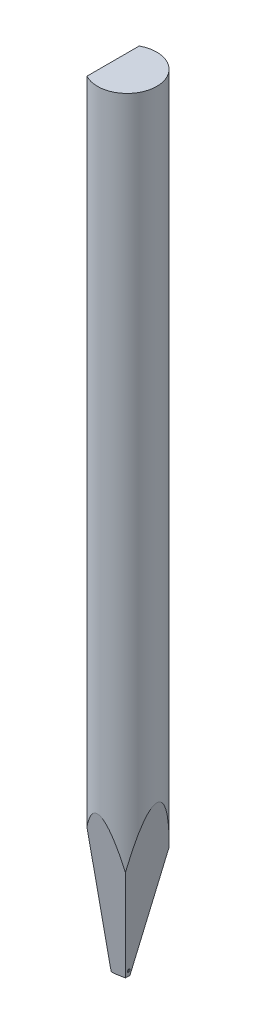
ISO-10303-21;
HEADER;
FILE_DESCRIPTION(('STEP AP214'),'2;1');
FILE_NAME('part.step','',(''),(''),'','','');
FILE_SCHEMA(('AUTOMOTIVE_DESIGN { 1 0 10303 214 1 1 1 1 }'));
ENDSEC;
DATA;
#1=APPLICATION_CONTEXT('core data for automotive mechanical design processes');
#2=APPLICATION_PROTOCOL_DEFINITION('international standard','automotive_design',2000,#1);
#3=PRODUCT_CONTEXT('',#1,'mechanical');
#4=PRODUCT('Part','Part','',(#3));
#5=PRODUCT_RELATED_PRODUCT_CATEGORY('part','',(#4));
#6=PRODUCT_DEFINITION_FORMATION('','',#4);
#7=PRODUCT_DEFINITION_CONTEXT('part definition',#1,'design');
#8=PRODUCT_DEFINITION('design','',#6,#7);
#9=PRODUCT_DEFINITION_SHAPE('','',#8);
#10=(LENGTH_UNIT() NAMED_UNIT(*) SI_UNIT(.MILLI.,.METRE.));
#11=(NAMED_UNIT(*) PLANE_ANGLE_UNIT() SI_UNIT($,.RADIAN.));
#12=(NAMED_UNIT(*) SI_UNIT($,.STERADIAN.) SOLID_ANGLE_UNIT());
#13=UNCERTAINTY_MEASURE_WITH_UNIT(LENGTH_MEASURE(1.E-05),#10,'distance_accuracy_value','');
#14=(GEOMETRIC_REPRESENTATION_CONTEXT(3) GLOBAL_UNCERTAINTY_ASSIGNED_CONTEXT((#13)) GLOBAL_UNIT_ASSIGNED_CONTEXT((#10,
#11,#12)) REPRESENTATION_CONTEXT('',''));
#15=CARTESIAN_POINT('',(0.,0.,0.));
#16=DIRECTION('',(0.,0.,1.));
#17=DIRECTION('',(1.,0.,0.));
#18=AXIS2_PLACEMENT_3D('',#15,#16,#17);
#19=CARTESIAN_POINT('',(26.8738719491216,0.,0.0508));
#20=DIRECTION('',(0.,-0.173648177666931,0.984807753012208));
#21=DIRECTION('',(0.,-0.984807753012208,-0.173648177666931));
#22=AXIS2_PLACEMENT_3D('',#19,#20,#21);
#23=PLANE('',#22);
#24=CARTESIAN_POINT('',(-0.35306,0.02286,0.0548308347789947));
#25=DIRECTION('',(0.,-0.173648177666931,0.984807753012208));
#26=DIRECTION('',(0.,-0.984807753012208,-0.173648177666931));
#27=AXIS2_PLACEMENT_3D('',#24,#25,#26);
#28=ELLIPSE('',#27,0.0232126523477081,0.02286);
#29=CARTESIAN_POINT('',(-0.353059999999999,0.,0.0507920612593779));
#30=VERTEX_POINT('',#29);
#31=CARTESIAN_POINT('',(-0.37592,0.02286,0.0548308347789947));
#32=VERTEX_POINT('',#31);
#33=EDGE_CURVE('E68',#30,#32,#28,.F.);
#34=ORIENTED_EDGE('',*,*,#33,.F.);
#35=CARTESIAN_POINT('',(-0.287020000000002,0.,0.0507841225187557));
#36=DIRECTION('',(-1.,0.,0.));
#37=VECTOR('',#36,1.);
#38=LINE('',#35,#37);
#39=CARTESIAN_POINT('',(-0.287019999999999,0.,0.0507920612593779));
#40=VERTEX_POINT('',#39);
#41=EDGE_CURVE('E234',#40,#30,#38,.T.);
#42=ORIENTED_EDGE('',*,*,#41,.F.);
#43=DIRECTION('',(-0.984346441568213,-0.173566836012845,-0.0306045161452665));
#44=VECTOR('',#43,1.);
#45=CARTESIAN_POINT('',(26.0301980698046,4.64043560289492,0.869033999030531));
#46=LINE('',#45,#44);
#47=CARTESIAN_POINT('',(0.0144531636701099,0.0531578527145794,0.060173163670107));
#48=VERTEX_POINT('',#47);
#49=EDGE_CURVE('E242',#48,#40,#46,.T.);
#50=ORIENTED_EDGE('',*,*,#49,.F.);
#51=DIRECTION('',(-0.171087869746036,-0.970287525247814,-0.171087869746036));
#52=VECTOR('',#51,1.);
#53=CARTESIAN_POINT('',(0.791557999082992,4.46033837772866,0.837277999082991));
#54=LINE('',#53,#52);
#55=CARTESIAN_POINT('',(0.537041505266774,3.0169036135559,0.582761505266773));
#56=VERTEX_POINT('',#55);
#57=EDGE_CURVE('E411',#56,#48,#54,.T.);
#58=ORIENTED_EDGE('',*,*,#57,.F.);
#59=CARTESIAN_POINT('',(0.,-0.288101116436578,0.));
#60=DIRECTION('',(0.,-0.173648177666931,0.984807753012208));
#61=DIRECTION('',(0.,-0.984807753012208,-0.173648177666931));
#62=AXIS2_PLACEMENT_3D('',#59,#60,#61);
#63=ELLIPSE('',#62,4.56371043248163,0.792479999999998);
#64=CARTESIAN_POINT('',(-0.37592,3.66844093071415,0.69764511322018));
#65=VERTEX_POINT('',#64);
#66=EDGE_CURVE('E447',#56,#65,#63,.T.);
#67=ORIENTED_EDGE('',*,*,#66,.T.);
#68=DIRECTION('',(0.,0.984807753012208,0.173648177666931));
#69=VECTOR('',#68,1.);
#70=CARTESIAN_POINT('',(-0.37592,20.251112252608,3.62161747949059));
#71=LINE('',#70,#69);
#72=EDGE_CURVE('E54',#32,#65,#71,.T.);
#73=ORIENTED_EDGE('',*,*,#72,.F.);
#74=EDGE_LOOP('',(#34,#42,#50,#58,#67,#73));
#75=FACE_BOUND('',#74,.T.);
#76=ADVANCED_FACE('F46',(#75),#23,.T.);
#77=CARTESIAN_POINT('',(26.8738719491216,0.,-0.0508));
#78=DIRECTION('',(0.,-0.173648177666931,-0.984807753012208));
#79=DIRECTION('',(0.,0.984807753012208,-0.173648177666931));
#80=AXIS2_PLACEMENT_3D('',#77,#78,#79);
#81=PLANE('',#80);
#82=CARTESIAN_POINT('',(-0.35306,0.02286,-0.0548308347789947));
#83=DIRECTION('',(0.,-0.173648177666931,-0.984807753012208));
#84=DIRECTION('',(0.,0.984807753012208,-0.173648177666931));
#85=AXIS2_PLACEMENT_3D('',#82,#83,#84);
#86=ELLIPSE('',#85,0.0232126523477081,0.02286);
#87=CARTESIAN_POINT('',(-0.37592,0.02286,-0.0548308347789947));
#88=VERTEX_POINT('',#87);
#89=CARTESIAN_POINT('',(-0.353059999999999,0.,-0.0507920612593779));
#90=VERTEX_POINT('',#89);
#91=EDGE_CURVE('E181',#88,#90,#86,.F.);
#92=ORIENTED_EDGE('',*,*,#91,.F.);
#93=DIRECTION('',(0.,-0.984807753012208,0.173648177666931));
#94=VECTOR('',#93,1.);
#95=CARTESIAN_POINT('',(-0.37592,20.5255765703836,-3.67001294395617));
#96=LINE('',#95,#94);
#97=CARTESIAN_POINT('',(-0.37592,3.66844093071414,-0.69764511322018));
#98=VERTEX_POINT('',#97);
#99=EDGE_CURVE('E174',#98,#88,#96,.T.);
#100=ORIENTED_EDGE('',*,*,#99,.F.);
#101=CARTESIAN_POINT('',(0.,-0.288101116436578,0.));
#102=DIRECTION('',(0.,-0.173648177666931,-0.984807753012208));
#103=DIRECTION('',(0.,-0.984807753012208,0.173648177666931));
#104=AXIS2_PLACEMENT_3D('',#101,#102,#103);
#105=ELLIPSE('',#104,4.56371043248163,0.792479999999998);
#106=CARTESIAN_POINT('',(0.537041505266774,3.0169036135559,-0.582761505266773));
#107=VERTEX_POINT('',#106);
#108=EDGE_CURVE('E448',#98,#107,#105,.T.);
#109=ORIENTED_EDGE('',*,*,#108,.T.);
#110=DIRECTION('',(0.171087869746036,0.970287525247814,-0.171087869746036));
#111=VECTOR('',#110,1.);
#112=CARTESIAN_POINT('',(0.791557999082992,4.46033837772866,-0.837277999082991));
#113=LINE('',#112,#111);
#114=CARTESIAN_POINT('',(0.0144531636701099,0.0531578527145794,-0.060173163670107));
#115=VERTEX_POINT('',#114);
#116=EDGE_CURVE('E422',#115,#107,#113,.T.);
#117=ORIENTED_EDGE('',*,*,#116,.F.);
#118=DIRECTION('',(0.984346441568213,0.173566836012845,-0.0306045161452665));
#119=VECTOR('',#118,1.);
#120=CARTESIAN_POINT('',(26.0301980698046,4.64043560289492,-0.869033999030531));
#121=LINE('',#120,#119);
#122=CARTESIAN_POINT('',(-0.287019999999999,0.,-0.0507920612593778));
#123=VERTEX_POINT('',#122);
#124=EDGE_CURVE('E419',#123,#115,#121,.T.);
#125=ORIENTED_EDGE('',*,*,#124,.F.);
#126=CARTESIAN_POINT('',(-0.287019999999996,0.,-0.0508000000000001));
#127=DIRECTION('',(-1.,0.,0.));
#128=VECTOR('',#127,1.);
#129=LINE('',#126,#128);
#130=EDGE_CURVE('E241',#123,#90,#129,.T.);
#131=ORIENTED_EDGE('',*,*,#130,.T.);
#132=EDGE_LOOP('',(#92,#100,#109,#117,#125,#131));
#133=FACE_BOUND('',#132,.T.);
#134=ADVANCED_FACE('F388',(#133),#81,.T.);
#135=CARTESIAN_POINT('',(-0.28702,0.,27.2760283406468));
#136=DIRECTION('',(-0.173648177666931,0.984807753012208,0.));
#137=DIRECTION('',(-0.984807753012208,-0.173648177666931,0.));
#138=AXIS2_PLACEMENT_3D('',#135,#136,#137);
#139=PLANE('',#138);
#140=DIRECTION('',(-0.984807753012208,-0.173648177666931,0.));
#141=VECTOR('',#140,1.);
#142=CARTESIAN_POINT('',(-0.28702,0.,0.0285749999999994));
#143=LINE('',#142,#141);
#144=CARTESIAN_POINT('',(-0.127,0.0282158434529687,0.0285749999999997));
#145=VERTEX_POINT('',#144);
#146=CARTESIAN_POINT('',(-0.272227206717192,0.00260836857580261,0.028575));
#147=VERTEX_POINT('',#146);
#148=EDGE_CURVE('E259',#145,#147,#143,.T.);
#149=ORIENTED_EDGE('',*,*,#148,.F.);
#150=DIRECTION('',(0.,0.,1.));
#151=VECTOR('',#150,1.);
#152=CARTESIAN_POINT('',(-0.127,0.0282158434529687,27.2760283406468));
#153=LINE('',#152,#151);
#154=CARTESIAN_POINT('',(-0.127,0.0282158434529687,-0.0285749999999997));
#155=VERTEX_POINT('',#154);
#156=EDGE_CURVE('E314',#155,#145,#153,.T.);
#157=ORIENTED_EDGE('',*,*,#156,.F.);
#158=DIRECTION('',(-0.984807753012208,-0.173648177666931,0.));
#159=VECTOR('',#158,1.);
#160=CARTESIAN_POINT('',(-0.28702,0.,-0.0285749999999994));
#161=LINE('',#160,#159);
#162=CARTESIAN_POINT('',(-0.272227206717192,0.00260836857580261,-0.028575));
#163=VERTEX_POINT('',#162);
#164=EDGE_CURVE('E267',#155,#163,#161,.T.);
#165=ORIENTED_EDGE('',*,*,#164,.T.);
#166=CARTESIAN_POINT('',(-2.19568989639233,-0.33655,0.));
#167=DIRECTION('',(-0.173648177666931,0.984807753012208,0.));
#168=DIRECTION('',(-0.984807753012208,-0.173648177666931,0.));
#169=AXIS2_PLACEMENT_3D('',#166,#167,#168);
#170=ELLIPSE('',#169,1.96005512164276,0.34036);
#171=EDGE_CURVE('E312',#163,#123,#170,.T.);
#172=ORIENTED_EDGE('',*,*,#171,.T.);
#173=ORIENTED_EDGE('',*,*,#124,.T.);
#174=DIRECTION('',(0.,0.,-1.));
#175=VECTOR('',#174,1.);
#176=CARTESIAN_POINT('',(0.014453163670107,0.0531578527145792,27.2760283406468));
#177=LINE('',#176,#175);
#178=EDGE_CURVE('E247',#48,#115,#177,.T.);
#179=ORIENTED_EDGE('',*,*,#178,.F.);
#180=ORIENTED_EDGE('',*,*,#49,.T.);
#181=EDGE_CURVE('E238',#40,#147,#170,.T.);
#182=ORIENTED_EDGE('',*,*,#181,.T.);
#183=EDGE_LOOP('',(#149,#157,#165,#172,#173,#179,#180,#182));
#184=FACE_BOUND('',#183,.T.);
#185=ADVANCED_FACE('F393',(#184),#139,.F.);
#186=CARTESIAN_POINT('',(26.7627469491216,-0.33655,0.));
#187=DIRECTION('',(-1.,0.,0.));
#188=DIRECTION('',(0.,0.,1.));
#189=AXIS2_PLACEMENT_3D('',#186,#187,#188);
#190=CYLINDRICAL_SURFACE('',#189,0.34036);
#191=ORIENTED_EDGE('',*,*,#41,.T.);
#192=CARTESIAN_POINT('',(-0.35306,0.,0.0507841225187557));
#193=CARTESIAN_POINT('',(-0.353273732251371,-9.93455820971052E-08,0.0507847439070931));
#194=CARTESIAN_POINT('',(-0.353486598537424,2.99334623186574E-06,0.0507642873292763));
#195=CARTESIAN_POINT('',(-0.353902742092885,1.4630189165336E-05,0.0506870964390779));
#196=CARTESIAN_POINT('',(-0.35410610834223,2.31025416714712E-05,0.0506308399024749));
#197=CARTESIAN_POINT('',(-0.354556535219782,4.76179327962945E-05,0.0504676252112715));
#198=CARTESIAN_POINT('',(-0.354799897489881,6.51160825404981E-05,0.0503508841630329));
#199=CARTESIAN_POINT('',(-0.355265694595863,0.000105452460850618,0.050080485148704));
#200=CARTESIAN_POINT('',(-0.355488001118318,0.00012832080215309,0.0499266188682784));
#201=CARTESIAN_POINT('',(-0.356067445330495,0.000195645530246314,0.0494710360603363));
#202=CARTESIAN_POINT('',(-0.356403754728676,0.000243625497238164,0.0491437041807787));
#203=CARTESIAN_POINT('',(-0.357026804482206,0.000344632628413902,0.048446506843932));
#204=CARTESIAN_POINT('',(-0.357313434035267,0.000397670675827821,0.0480765492983263));
#205=CARTESIAN_POINT('',(-0.358378057636994,0.000611918919671736,0.0465623363900982));
#206=CARTESIAN_POINT('',(-0.359016311865305,0.000781127617140467,0.0453235022218633));
#207=CARTESIAN_POINT('',(-0.36013059722155,0.00111402197564484,0.0427745531027652));
#208=CARTESIAN_POINT('',(-0.360605465248352,0.00127766085635117,0.0414640010670005));
#209=CARTESIAN_POINT('',(-0.362584568080406,0.002008118820825,0.0353085475165215));
#210=CARTESIAN_POINT('',(-0.363495230582201,0.00249838071774205,0.0302703322572467));
#211=CARTESIAN_POINT('',(-0.364823321586656,0.00325235849537557,0.0201419071394403));
#212=CARTESIAN_POINT('',(-0.365240089826929,0.00351577098433887,0.0150516368339784));
#213=CARTESIAN_POINT('',(-0.365778267938912,0.00385767780351304,0.00332616977082086));
#214=CARTESIAN_POINT('',(-0.365775430768373,0.00385816517747639,-0.00331950750880186));
#215=CARTESIAN_POINT('',(-0.365266639149005,0.00353105773718139,-0.0145204520289892));
#216=CARTESIAN_POINT('',(-0.364916484477492,0.00330483640163193,-0.0190868577497379));
#217=CARTESIAN_POINT('',(-0.363978403382856,0.00277102331687548,-0.026759049778665));
#218=CARTESIAN_POINT('',(-0.363497288651625,0.00251012962693329,-0.0298804408246984));
#219=CARTESIAN_POINT('',(-0.362424530272285,0.0020001382294659,-0.0351192845199153));
#220=CARTESIAN_POINT('',(-0.361911133605502,0.00177163215710282,-0.0372530605981886));
#221=CARTESIAN_POINT('',(-0.360832418030956,0.00135694241051024,-0.0408173817218154));
#222=CARTESIAN_POINT('',(-0.360328019903348,0.00117840123560226,-0.0422682298447167));
#223=CARTESIAN_POINT('',(-0.35908424414081,0.000796369329995037,-0.0452175970915648));
#224=CARTESIAN_POINT('',(-0.358329807165545,0.000592015364291506,-0.0467112332602745));
#225=CARTESIAN_POINT('',(-0.357139309854834,0.000366162246895788,-0.0482960308209531));
#226=CARTESIAN_POINT('',(-0.356933326137472,0.000329480471809322,-0.0485510884269767));
#227=CARTESIAN_POINT('',(-0.356495963389522,0.000258571889494354,-0.0490405428510903));
#228=CARTESIAN_POINT('',(-0.356264510869409,0.000224352684084868,-0.0492748761646753));
#229=CARTESIAN_POINT('',(-0.355768337270183,0.000159605918408698,-0.0497154058644484));
#230=CARTESIAN_POINT('',(-0.355503143126198,0.000129146188240359,-0.049921092043226));
#231=CARTESIAN_POINT('',(-0.354940250662,7.57279632825567E-05,-0.0502800299598191));
#232=CARTESIAN_POINT('',(-0.354642858691501,5.27058583371373E-05,-0.0504337268986295));
#233=CARTESIAN_POINT('',(-0.35412946440525,2.41515479780461E-05,-0.0506238713433873));
#234=CARTESIAN_POINT('',(-0.353922029265928,1.53119510557178E-05,-0.0506825715908257));
#235=CARTESIAN_POINT('',(-0.353496797994712,3.13995531589901E-06,-0.0507633158270858));
#236=CARTESIAN_POINT('',(-0.353278891319247,-1.0527428366797E-07,-0.0507847796446877));
#237=CARTESIAN_POINT('',(-0.353060000019584,-5.29313372982312E-12,-0.0507841225707866));
#238=B_SPLINE_CURVE_WITH_KNOTS('',3,(#192,#193,#194,#195,#196,#197,#198,#199,#200,#201,#202,
#203,#204,#205,#206,#207,#208,#209,#210,#211,#212,#213,#214,#215,#216,#217,#218,#219,#220,#221,
#222,#223,#224,#225,#226,#227,#228,#229,#230,#231,#232,#233,#234,#235,#236,#237),.UNSPECIFIED.,
.F.,.F.,(4,2,2,2,2,2,2,2,2,2,2,2,2,2,2,2,2,2,2,2,2,2,4),(0.,0.000638802240630763,
0.00126925305763246,0.00207613009026082,0.00288764443873113,0.00429491791191487,
0.00570529076795619,0.00988377805642078,0.0140914235654447,0.0294114096159924,
0.0447518531638712,0.0646417067345946,0.0783830095080612,0.0878810608792752,0.0944873828848153,
0.099127675375888,0.104123988154405,0.105112374065888,0.106103690675324,0.107110869108384,
0.108109190431932,0.108753248673418,0.109407254603341),.UNSPECIFIED.);
#239=CARTESIAN_POINT('',(-0.363588197104039,0.00257677013584347,0.0289435277090794));
#240=VERTEX_POINT('',#239);
#241=EDGE_CURVE('E188',#30,#240,#238,.T.);
#242=ORIENTED_EDGE('',*,*,#241,.T.);
#243=CARTESIAN_POINT('',(-0.37592,0.,-0.0507841225187556));
#244=CARTESIAN_POINT('',(-0.365758080833508,0.00253508631818983,-0.0339839247783755));
#245=CARTESIAN_POINT('',(-0.355600000000001,0.00380999999999998,-0.0169914649143359));
#246=CARTESIAN_POINT('',(-0.355600000000001,0.00380999999999998,0.0169914649143359));
#247=CARTESIAN_POINT('',(-0.365758080833508,0.00253508631818984,0.0339839247783755));
#248=CARTESIAN_POINT('',(-0.37592,0.,0.0507841225187557));
#249=(BOUNDED_CURVE() B_SPLINE_CURVE(3,(#243,#244,#245,#246,#247,#248),.UNSPECIFIED.,.F.,
.F.) B_SPLINE_CURVE_WITH_KNOTS((4,2,4),(1.42102999679081,1.5707963267949,1.72056265679899),
.UNSPECIFIED.) CURVE() GEOMETRIC_REPRESENTATION_ITEM() RATIONAL_B_SPLINE_CURVE((1.,1.,1.,1.,1.,1.)) REPRESENTATION_ITEM(''));
#250=CARTESIAN_POINT('',(-0.36358815467409,0.00257676834516373,-0.0289435487161978));
#251=VERTEX_POINT('',#250);
#252=EDGE_CURVE('E166',#240,#251,#249,.F.);
#253=ORIENTED_EDGE('',*,*,#252,.T.);
#254=EDGE_CURVE('E180',#251,#90,#238,.T.);
#255=ORIENTED_EDGE('',*,*,#254,.T.);
#256=ORIENTED_EDGE('',*,*,#130,.F.);
#257=ORIENTED_EDGE('',*,*,#171,.F.);
#258=DIRECTION('',(-1.,0.,0.));
#259=VECTOR('',#258,1.);
#260=CARTESIAN_POINT('',(26.7627469491216,0.00260836857580261,-0.028575));
#261=LINE('',#260,#259);
#262=CARTESIAN_POINT('',(-0.282998489816427,0.00260836857580251,-0.028575));
#263=VERTEX_POINT('',#262);
#264=EDGE_CURVE('E334',#163,#263,#261,.T.);
#265=ORIENTED_EDGE('',*,*,#264,.T.);
#266=CARTESIAN_POINT('',(-0.282998489816428,0.00260836857580261,0.028575));
#267=CARTESIAN_POINT('',(-0.291059100214747,0.00221626932534536,0.0332288492425153));
#268=CARTESIAN_POINT('',(-0.301981797844348,0.00224694405598071,0.033033854600958));
#269=CARTESIAN_POINT('',(-0.320296392575134,0.0031305638467112,0.0221747468136102));
#270=CARTESIAN_POINT('',(-0.327068855863134,0.00381431132404131,0.0112699230251961));
#271=CARTESIAN_POINT('',(-0.326994835670748,0.00380563943309758,-0.0115288461768753));
#272=CARTESIAN_POINT('',(-0.320183586112604,0.0031190469839673,-0.0223381582503348));
#273=CARTESIAN_POINT('',(-0.301856503578037,0.0022400805970254,-0.0330958620083327));
#274=CARTESIAN_POINT('',(-0.291022558634216,0.00221755981884729,-0.0332135322986562));
#275=CARTESIAN_POINT('',(-0.282998489816427,0.00260836857580261,-0.028575));
#276=(BOUNDED_CURVE() B_SPLINE_CURVE(3,(#266,#267,#268,#269,#270,#271,#272,#273,#274,#275),
.UNSPECIFIED.,.F.,.F.) B_SPLINE_CURVE_WITH_KNOTS((4,2,2,2,4),(0.,2.38139585135656E-05,
4.7627917027131E-05,7.14418755406964E-05,9.52558340542618E-05),
.UNSPECIFIED.) CURVE() GEOMETRIC_REPRESENTATION_ITEM() RATIONAL_B_SPLINE_CURVE((1.,1.,1.,1.,1.,
1.,1.,1.,1.,1.)) REPRESENTATION_ITEM(''));
#277=CARTESIAN_POINT('',(-0.282998489816427,0.0026083685758023,0.028575));
#278=VERTEX_POINT('',#277);
#279=EDGE_CURVE('E316',#263,#278,#276,.F.);
#280=ORIENTED_EDGE('',*,*,#279,.T.);
#281=DIRECTION('',(-1.,0.,0.));
#282=VECTOR('',#281,1.);
#283=CARTESIAN_POINT('',(26.7627469491216,0.00260836857580261,0.028575));
#284=LINE('',#283,#282);
#285=EDGE_CURVE('E317',#147,#278,#284,.T.);
#286=ORIENTED_EDGE('',*,*,#285,.F.);
#287=ORIENTED_EDGE('',*,*,#181,.F.);
#288=EDGE_LOOP('',(#191,#242,#253,#255,#256,#257,#265,#280,#286,#287));
#289=FACE_BOUND('',#288,.T.);
#290=ADVANCED_FACE('F203',(#289),#190,.F.);
#291=CARTESIAN_POINT('',(0.,21.0312,0.));
#292=DIRECTION('',(0.,-1.,0.));
#293=DIRECTION('',(0.,0.,-1.));
#294=AXIS2_PLACEMENT_3D('',#291,#292,#293);
#295=CYLINDRICAL_SURFACE('',#294,0.792479999999998);
#296=ORIENTED_EDGE('',*,*,#66,.F.);
#297=CARTESIAN_POINT('',(0.,-0.0288101116436568,0.));
#298=DIRECTION('',(-0.984807753012208,0.173648177666931,0.));
#299=DIRECTION('',(-0.173648177666931,-0.984807753012208,0.));
#300=AXIS2_PLACEMENT_3D('',#297,#298,#299);
#301=ELLIPSE('',#300,4.56371043248164,0.792479999999998);
#302=EDGE_CURVE('E309',#56,#107,#301,.T.);
#303=ORIENTED_EDGE('',*,*,#302,.T.);
#304=ORIENTED_EDGE('',*,*,#108,.F.);
#305=DIRECTION('',(0.,-1.,0.));
#306=VECTOR('',#305,1.);
#307=CARTESIAN_POINT('',(-0.37592,21.0312,-0.69764511322018));
#308=LINE('',#307,#306);
#309=CARTESIAN_POINT('',(-0.37592,21.0312,-0.69764511322018));
#310=VERTEX_POINT('',#309);
#311=EDGE_CURVE('E439',#310,#98,#308,.T.);
#312=ORIENTED_EDGE('',*,*,#311,.F.);
#313=CARTESIAN_POINT('',(0.,21.0312,0.));
#314=DIRECTION('',(0.,1.,0.));
#315=DIRECTION('',(0.,0.,1.));
#316=AXIS2_PLACEMENT_3D('',#313,#314,#315);
#317=CIRCLE('',#316,0.792479999999998);
#318=CARTESIAN_POINT('',(-0.37592,21.0312,0.69764511322018));
#319=VERTEX_POINT('',#318);
#320=EDGE_CURVE('E436',#319,#310,#317,.T.);
#321=ORIENTED_EDGE('',*,*,#320,.F.);
#322=DIRECTION('',(0.,-1.,0.));
#323=VECTOR('',#322,1.);
#324=CARTESIAN_POINT('',(-0.37592,21.0312,0.69764511322018));
#325=LINE('',#324,#323);
#326=EDGE_CURVE('E444',#65,#319,#325,.F.);
#327=ORIENTED_EDGE('',*,*,#326,.F.);
#328=EDGE_LOOP('',(#296,#303,#304,#312,#321,#327));
#329=FACE_BOUND('',#328,.T.);
#330=ADVANCED_FACE('F459',(#329),#295,.T.);
#331=CARTESIAN_POINT('',(-0.37592,21.0312,-0.80247998));
#332=DIRECTION('',(-1.,0.,0.));
#333=DIRECTION('',(0.,0.,1.));
#334=AXIS2_PLACEMENT_3D('',#331,#332,#333);
#335=PLANE('',#334);
#336=DIRECTION('',(0.,0.,-1.));
#337=VECTOR('',#336,1.);
#338=CARTESIAN_POINT('',(-0.37592,0.02286,26.4466652534773));
#339=LINE('',#338,#337);
#340=CARTESIAN_POINT('',(-0.37592,0.0228562924946129,0.0105849332162115));
#341=VERTEX_POINT('',#340);
#342=EDGE_CURVE('E76',#32,#341,#339,.T.);
#343=ORIENTED_EDGE('',*,*,#342,.F.);
#344=ORIENTED_EDGE('',*,*,#72,.T.);
#345=ORIENTED_EDGE('',*,*,#326,.T.);
#346=DIRECTION('',(0.,0.,-1.));
#347=VECTOR('',#346,1.);
#348=CARTESIAN_POINT('',(-0.37592,21.0312,-0.80247998));
#349=LINE('',#348,#347);
#350=EDGE_CURVE('E452',#319,#310,#349,.T.);
#351=ORIENTED_EDGE('',*,*,#350,.T.);
#352=ORIENTED_EDGE('',*,*,#311,.T.);
#353=ORIENTED_EDGE('',*,*,#99,.T.);
#354=CARTESIAN_POINT('',(-0.37592,0.02286,-0.0102586919445667));
#355=VERTEX_POINT('',#354);
#356=EDGE_CURVE('E171',#355,#88,#339,.T.);
#357=ORIENTED_EDGE('',*,*,#356,.F.);
#358=CARTESIAN_POINT('',(-0.37592,0.,0.0507841225187557));
#359=CARTESIAN_POINT('',(-0.37592,0.0124912996373636,0.0356119424462526));
#360=CARTESIAN_POINT('',(-0.37592,0.0241300000000007,0.0180052989584167));
#361=CARTESIAN_POINT('',(-0.37592,0.0241300000000007,-0.0180052989584167));
#362=CARTESIAN_POINT('',(-0.37592,0.0124912996373624,-0.0356119424462515));
#363=CARTESIAN_POINT('',(-0.37592,0.,-0.0507841225187556));
#364=(BOUNDED_CURVE() B_SPLINE_CURVE(3,(#358,#359,#360,#361,#362,#363),.UNSPECIFIED.,.F.,
.F.) B_SPLINE_CURVE_WITH_KNOTS((4,2,4),(1.42102999679081,1.5707963267949,1.72056265679899),
.UNSPECIFIED.) CURVE() GEOMETRIC_REPRESENTATION_ITEM() RATIONAL_B_SPLINE_CURVE((1.,1.,1.,1.,1.,1.)) REPRESENTATION_ITEM(''));
#365=EDGE_CURVE('E160',#355,#341,#364,.F.);
#366=ORIENTED_EDGE('',*,*,#365,.T.);
#367=EDGE_LOOP('',(#343,#344,#345,#351,#352,#353,#357,#366));
#368=FACE_BOUND('',#367,.T.);
#369=ADVANCED_FACE('F172',(#368),#335,.T.);
#370=CARTESIAN_POINT('',(0.,21.0312,0.));
#371=DIRECTION('',(0.,1.,0.));
#372=DIRECTION('',(0.,0.,1.));
#373=AXIS2_PLACEMENT_3D('',#370,#371,#372);
#374=PLANE('',#373);
#375=ORIENTED_EDGE('',*,*,#320,.T.);
#376=ORIENTED_EDGE('',*,*,#350,.F.);
#377=EDGE_LOOP('',(#375,#376));
#378=FACE_BOUND('',#377,.T.);
#379=ADVANCED_FACE('F458',(#378),#374,.T.);
#380=CARTESIAN_POINT('',(0.014453163670107,0.0531578527145792,27.2760283406468));
#381=DIRECTION('',(-0.984807753012208,0.173648177666931,0.));
#382=DIRECTION('',(-0.173648177666931,-0.984807753012208,0.));
#383=AXIS2_PLACEMENT_3D('',#380,#381,#382);
#384=PLANE('',#383);
#385=CARTESIAN_POINT('',(0.0416506766308395,0.207402613507598,0.));
#386=DIRECTION('',(-0.984807753012208,0.173648177666931,0.));
#387=DIRECTION('',(0.173648177666931,0.984807753012208,0.));
#388=AXIS2_PLACEMENT_3D('',#385,#386,#387);
#389=ELLIPSE('',#388,0.0439502823592256,0.0315688581959235);
#390=CARTESIAN_POINT('',(0.0492825630704661,0.250685192322039,0.));
#391=VERTEX_POINT('',#390);
#392=EDGE_CURVE('E266',#391,#391,#389,.F.);
#393=ORIENTED_EDGE('',*,*,#392,.F.);
#394=EDGE_LOOP('',(#393));
#395=FACE_BOUND('',#394,.T.);
#396=ORIENTED_EDGE('',*,*,#302,.F.);
#397=ORIENTED_EDGE('',*,*,#57,.T.);
#398=ORIENTED_EDGE('',*,*,#178,.T.);
#399=ORIENTED_EDGE('',*,*,#116,.T.);
#400=EDGE_LOOP('',(#396,#397,#398,#399));
#401=FACE_BOUND('',#400,.T.);
#402=ADVANCED_FACE('F373',(#395,#401),#384,.F.);
#403=CARTESIAN_POINT('',(-0.127,0.0965200000000001,0.028575));
#404=DIRECTION('',(-1.,0.,0.));
#405=DIRECTION('',(0.,0.,1.));
#406=AXIS2_PLACEMENT_3D('',#403,#404,#405);
#407=PLANE('',#406);
#408=ORIENTED_EDGE('',*,*,#156,.T.);
#409=DIRECTION('',(0.,1.,0.));
#410=VECTOR('',#409,1.);
#411=CARTESIAN_POINT('',(-0.127,0.0965200000000001,0.028575));
#412=LINE('',#411,#410);
#413=CARTESIAN_POINT('',(-0.127,0.0965200000000001,0.028575));
#414=VERTEX_POINT('',#413);
#415=EDGE_CURVE('E285',#145,#414,#412,.T.);
#416=ORIENTED_EDGE('',*,*,#415,.T.);
#417=DIRECTION('',(0.,0.,-1.));
#418=VECTOR('',#417,1.);
#419=CARTESIAN_POINT('',(-0.127,0.0965200000000001,0.028575));
#420=LINE('',#419,#418);
#421=CARTESIAN_POINT('',(-0.127,0.0965200000000001,0.01905));
#422=VERTEX_POINT('',#421);
#423=EDGE_CURVE('E273',#414,#422,#420,.T.);
#424=ORIENTED_EDGE('',*,*,#423,.T.);
#425=CARTESIAN_POINT('',(-0.127,0.0965200000000001,0.));
#426=DIRECTION('',(1.,0.,0.));
#427=DIRECTION('',(0.,1.,0.));
#428=AXIS2_PLACEMENT_3D('',#425,#426,#427);
#429=ELLIPSE('',#428,0.0219970452561247,0.01905);
#430=CARTESIAN_POINT('',(-0.127,0.0965200000000001,-0.0190499999999996));
#431=VERTEX_POINT('',#430);
#432=EDGE_CURVE('E284',#431,#422,#429,.F.);
#433=ORIENTED_EDGE('',*,*,#432,.F.);
#434=CARTESIAN_POINT('',(-0.127,0.0965200000000001,-0.028575));
#435=VERTEX_POINT('',#434);
#436=EDGE_CURVE('E277',#431,#435,#420,.T.);
#437=ORIENTED_EDGE('',*,*,#436,.T.);
#438=DIRECTION('',(0.,1.,0.));
#439=VECTOR('',#438,1.);
#440=CARTESIAN_POINT('',(-0.127,0.0965200000000001,-0.028575));
#441=LINE('',#440,#439);
#442=EDGE_CURVE('E278',#155,#435,#441,.T.);
#443=ORIENTED_EDGE('',*,*,#442,.F.);
#444=EDGE_LOOP('',(#408,#416,#424,#433,#437,#443));
#445=FACE_BOUND('',#444,.T.);
#446=ADVANCED_FACE('F303',(#445),#407,.T.);
#447=CARTESIAN_POINT('',(0.0169389803475446,0.179623209050534,0.));
#448=DIRECTION('',(0.866025403784441,0.499999999999995,0.));
#449=DIRECTION('',(-0.499999999999995,0.866025403784441,0.));
#450=AXIS2_PLACEMENT_3D('',#447,#448,#449);
#451=CONICAL_SURFACE('',#450,0.01905,0.392699081698725);
#452=CARTESIAN_POINT('',(0.0169389803475446,0.179623209050534,0.));
#453=DIRECTION('',(0.866025403784441,0.499999999999995,0.));
#454=DIRECTION('',(-0.499999999999995,0.866025403784441,0.));
#455=AXIS2_PLACEMENT_3D('',#452,#453,#454);
#456=CIRCLE('',#455,0.01905);
#457=CARTESIAN_POINT('',(0.00741398034754469,0.196120992992628,0.));
#458=VERTEX_POINT('',#457);
#459=EDGE_CURVE('E186',#458,#458,#456,.T.);
#460=ORIENTED_EDGE('',*,*,#459,.F.);
#461=EDGE_LOOP('',(#460));
#462=FACE_BOUND('',#461,.T.);
#463=ORIENTED_EDGE('',*,*,#392,.T.);
#464=EDGE_LOOP('',(#463));
#465=FACE_BOUND('',#464,.T.);
#466=ADVANCED_FACE('F211',(#462,#465),#451,.F.);
#467=CARTESIAN_POINT('',(-0.22877858413363,0.0965200000000001,0.));
#468=DIRECTION('',(-0.500000000000004,-0.866025403784436,0.));
#469=DIRECTION('',(0.866025403784436,-0.500000000000004,0.));
#470=AXIS2_PLACEMENT_3D('',#467,#468,#469);
#471=CYLINDRICAL_SURFACE('',#470,0.028575);
#472=DIRECTION('',(-0.500000000000004,-0.866025403784436,0.));
#473=VECTOR('',#472,1.);
#474=CARTESIAN_POINT('',(-0.213378324086859,0.12319403285078,0.028575));
#475=LINE('',#474,#473);
#476=CARTESIAN_POINT('',(-0.22877858413363,0.0965200000000001,0.028575));
#477=VERTEX_POINT('',#476);
#478=EDGE_CURVE('E276',#477,#278,#475,.T.);
#479=ORIENTED_EDGE('',*,*,#478,.T.);
#480=CARTESIAN_POINT('',(-0.282998489816427,0.00260836857580261,-0.028575));
#481=CARTESIAN_POINT('',(-0.291024965217661,0.00726516076958896,-0.0285750000000001));
#482=CARTESIAN_POINT('',(-0.297454069961336,0.00980772083814246,-0.0246677652429079));
#483=CARTESIAN_POINT('',(-0.30680470638007,0.0131325634305102,-0.0140922105999722));
#484=CARTESIAN_POINT('',(-0.309409884530429,0.0139726401064734,-0.00714153323062027));
#485=CARTESIAN_POINT('',(-0.309458673133645,0.0139673876968949,0.0069811805518812));
#486=CARTESIAN_POINT('',(-0.30688222178325,0.0131243082575392,0.0139838160543512));
#487=CARTESIAN_POINT('',(-0.297553297601776,0.00979968639561016,0.0246185446540691));
#488=CARTESIAN_POINT('',(-0.291057954934888,0.00727750260509063,0.0285749999999999));
#489=CARTESIAN_POINT('',(-0.282998489816428,0.00260836857580261,0.028575));
#490=(BOUNDED_CURVE() B_SPLINE_CURVE(3,(#480,#481,#482,#483,#484,#485,#486,#487,#488,#489),
.UNSPECIFIED.,.F.,.F.) B_SPLINE_CURVE_WITH_KNOTS((4,2,2,2,4),(0.,2.38139585135656E-05,
4.7627917027131E-05,7.14418755406964E-05,9.52558340542618E-05),
.UNSPECIFIED.) CURVE() GEOMETRIC_REPRESENTATION_ITEM() RATIONAL_B_SPLINE_CURVE((1.,1.,1.,1.,1.,
1.,1.,1.,1.,1.)) REPRESENTATION_ITEM(''));
#491=EDGE_CURVE('E347',#278,#263,#490,.F.);
#492=ORIENTED_EDGE('',*,*,#491,.T.);
#493=DIRECTION('',(0.500000000000004,0.866025403784436,0.));
#494=VECTOR('',#493,1.);
#495=CARTESIAN_POINT('',(-0.22877858413363,0.0965200000000001,-0.028575));
#496=LINE('',#495,#494);
#497=CARTESIAN_POINT('',(-0.22877858413363,0.0965200000000001,-0.028575));
#498=VERTEX_POINT('',#497);
#499=EDGE_CURVE('E272',#263,#498,#496,.T.);
#500=ORIENTED_EDGE('',*,*,#499,.T.);
#501=CARTESIAN_POINT('',(-0.22877858413363,0.0965200000000001,0.));
#502=DIRECTION('',(0.,-1.,0.));
#503=DIRECTION('',(-1.,0.,0.));
#504=AXIS2_PLACEMENT_3D('',#501,#502,#503);
#505=ELLIPSE('',#504,0.0329955678841872,0.028575);
#506=EDGE_CURVE('E270',#498,#477,#505,.F.);
#507=ORIENTED_EDGE('',*,*,#506,.T.);
#508=EDGE_LOOP('',(#479,#492,#500,#507));
#509=FACE_BOUND('',#508,.T.);
#510=ADVANCED_FACE('F302',(#509),#471,.F.);
#511=CARTESIAN_POINT('',(0.,0.,0.028575));
#512=DIRECTION('',(0.,0.,-1.));
#513=DIRECTION('',(-1.,0.,0.));
#514=AXIS2_PLACEMENT_3D('',#511,#512,#513);
#515=PLANE('',#514);
#516=ORIENTED_EDGE('',*,*,#148,.T.);
#517=ORIENTED_EDGE('',*,*,#285,.T.);
#518=ORIENTED_EDGE('',*,*,#478,.F.);
#519=DIRECTION('',(-1.,0.,0.));
#520=VECTOR('',#519,1.);
#521=CARTESIAN_POINT('',(-0.261774152017817,0.0965200000000001,0.028575));
#522=LINE('',#521,#520);
#523=EDGE_CURVE('E280',#414,#477,#522,.T.);
#524=ORIENTED_EDGE('',*,*,#523,.F.);
#525=ORIENTED_EDGE('',*,*,#415,.F.);
#526=EDGE_LOOP('',(#516,#517,#518,#524,#525));
#527=FACE_BOUND('',#526,.T.);
#528=ADVANCED_FACE('F365',(#527),#515,.T.);
#529=CARTESIAN_POINT('',(0.,0.,-0.028575));
#530=DIRECTION('',(0.,0.,-1.));
#531=DIRECTION('',(-1.,0.,0.));
#532=AXIS2_PLACEMENT_3D('',#529,#530,#531);
#533=PLANE('',#532);
#534=ORIENTED_EDGE('',*,*,#442,.T.);
#535=DIRECTION('',(-1.,0.,0.));
#536=VECTOR('',#535,1.);
#537=CARTESIAN_POINT('',(-0.261774152017817,0.0965200000000001,-0.028575));
#538=LINE('',#537,#536);
#539=EDGE_CURVE('E281',#435,#498,#538,.T.);
#540=ORIENTED_EDGE('',*,*,#539,.T.);
#541=ORIENTED_EDGE('',*,*,#499,.F.);
#542=ORIENTED_EDGE('',*,*,#264,.F.);
#543=ORIENTED_EDGE('',*,*,#164,.F.);
#544=EDGE_LOOP('',(#534,#540,#541,#542,#543));
#545=FACE_BOUND('',#544,.T.);
#546=ADVANCED_FACE('F369',(#545),#533,.F.);
#547=CARTESIAN_POINT('',(-0.261774152017817,0.0965200000000001,0.028575));
#548=DIRECTION('',(0.,-1.,0.));
#549=DIRECTION('',(0.,0.,-1.));
#550=AXIS2_PLACEMENT_3D('',#547,#548,#549);
#551=PLANE('',#550);
#552=ORIENTED_EDGE('',*,*,#539,.F.);
#553=ORIENTED_EDGE('',*,*,#436,.F.);
#554=CARTESIAN_POINT('',(-0.127,0.0965200000000001,0.));
#555=DIRECTION('',(0.,1.,0.));
#556=DIRECTION('',(1.,0.,0.));
#557=AXIS2_PLACEMENT_3D('',#554,#555,#556);
#558=ELLIPSE('',#557,0.0381000000000004,0.01905);
#559=EDGE_CURVE('E291',#422,#431,#558,.F.);
#560=ORIENTED_EDGE('',*,*,#559,.F.);
#561=ORIENTED_EDGE('',*,*,#423,.F.);
#562=ORIENTED_EDGE('',*,*,#523,.T.);
#563=ORIENTED_EDGE('',*,*,#506,.F.);
#564=EDGE_LOOP('',(#552,#553,#560,#561,#562,#563));
#565=FACE_BOUND('',#564,.T.);
#566=ADVANCED_FACE('F366',(#565),#551,.T.);
#567=CARTESIAN_POINT('',(-0.36417171334658,-0.0404111525448111,0.));
#568=DIRECTION('',(0.866025403784441,0.499999999999995,0.));
#569=DIRECTION('',(-0.499999999999995,0.866025403784441,0.));
#570=AXIS2_PLACEMENT_3D('',#567,#568,#569);
#571=CYLINDRICAL_SURFACE('',#570,0.01905);
#572=ORIENTED_EDGE('',*,*,#432,.T.);
#573=ORIENTED_EDGE('',*,*,#559,.T.);
#574=EDGE_LOOP('',(#572,#573));
#575=FACE_BOUND('',#574,.T.);
#576=ORIENTED_EDGE('',*,*,#459,.T.);
#577=EDGE_LOOP('',(#576));
#578=FACE_BOUND('',#577,.T.);
#579=ADVANCED_FACE('F298',(#575,#578),#571,.F.);
#580=CARTESIAN_POINT('',(-0.282998489816427,0.00260836857580261,-0.028575));
#581=CARTESIAN_POINT('',(-0.291022558634216,0.00221755981884729,-0.0332135322986562));
#582=CARTESIAN_POINT('',(-0.301856503578037,0.0022400805970254,-0.0330958620083327));
#583=CARTESIAN_POINT('',(-0.320183586112604,0.0031190469839673,-0.0223381582503348));
#584=CARTESIAN_POINT('',(-0.326994835670748,0.00380563943309758,-0.0115288461768753));
#585=CARTESIAN_POINT('',(-0.327068855863134,0.00381431132404131,0.0112699230251961));
#586=CARTESIAN_POINT('',(-0.320296392575134,0.0031305638467112,0.0221747468136102));
#587=CARTESIAN_POINT('',(-0.301981797844348,0.00224694405598071,0.033033854600958));
#588=CARTESIAN_POINT('',(-0.291059100214747,0.00221626932534536,0.0332288492425153));
#589=CARTESIAN_POINT('',(-0.282998489816428,0.00260836857580261,0.028575));
#590=CARTESIAN_POINT('',(-0.282998489816427,0.00260836857580261,-0.028575));
#591=CARTESIAN_POINT('',(-0.290256962758153,0.00260876055560114,-0.0285741662095625));
#592=CARTESIAN_POINT('',(-0.298361929050099,0.00287957069673049,-0.026534654295528));
#593=CARTESIAN_POINT('',(-0.310904887738006,0.00350059584721718,-0.016454989992142));
#594=CARTESIAN_POINT('',(-0.315270052831377,0.00380799896315519,-0.0083748538469737));
#595=CARTESIAN_POINT('',(-0.315330198104902,0.00381197852691439,0.0081858720791391));
#596=CARTESIAN_POINT('',(-0.31099877886462,0.00350612718148518,0.016335509591755));
#597=CARTESIAN_POINT('',(-0.298471776178699,0.00288331781779164,0.026489415347547));
#598=CARTESIAN_POINT('',(-0.290288305336989,0.00260871264191577,0.0285747525397295));
#599=CARTESIAN_POINT('',(-0.282998489816428,0.00260836857580261,0.028575));
#600=CARTESIAN_POINT('',(-0.282998489816427,0.00260836857580261,-0.028575));
#601=CARTESIAN_POINT('',(-0.291024965217661,0.00726516076958896,-0.0285750000000001));
#602=CARTESIAN_POINT('',(-0.297454069961336,0.00980772083814246,-0.0246677652429079));
#603=CARTESIAN_POINT('',(-0.30680470638007,0.0131325634305102,-0.0140922105999722));
#604=CARTESIAN_POINT('',(-0.309409884530429,0.0139726401064734,-0.00714153323062027));
#605=CARTESIAN_POINT('',(-0.309458673133645,0.0139673876968949,0.0069811805518812));
#606=CARTESIAN_POINT('',(-0.30688222178325,0.0131243082575392,0.0139838160543512));
#607=CARTESIAN_POINT('',(-0.297553297601776,0.00979968639561016,0.0246185446540691));
#608=CARTESIAN_POINT('',(-0.291057954934888,0.00727750260509063,0.0285749999999999));
#609=CARTESIAN_POINT('',(-0.282998489816428,0.00260836857580261,0.028575));
#610=(BOUNDED_SURFACE() B_SPLINE_SURFACE(2,3,((#580,#581,#582,#583,#584,#585,#586,#587,#588,
#589),(#590,#591,#592,#593,#594,#595,#596,#597,#598,#599),(#600,#601,#602,#603,#604,#605,#606,
#607,#608,#609)),.UNSPECIFIED.,.F.,.F.,.F.) B_SPLINE_SURFACE_WITH_KNOTS((3,3),(4,2,2,2,4),(0.,
1.),(0.,2.38139585135656E-05,4.7627917027131E-05,7.14418755406964E-05,9.52558340542618E-05),
.UNSPECIFIED.) GEOMETRIC_REPRESENTATION_ITEM() RATIONAL_B_SPLINE_SURFACE(((1.,1.,1.,1.,1.,1.,1.,
1.,1.,1.),(0.736191287601459,0.795437788404262,0.82530384819538,0.860781274302705,
0.865976760447354,0.866073506091774,0.86095149561744,0.825623070257572,0.795671165272081,
0.736191287601463),(1.,1.,1.,1.,1.,1.,1.,1.,1.,1.))) REPRESENTATION_ITEM('') SURFACE());
#611=ORIENTED_EDGE('',*,*,#279,.F.);
#612=ORIENTED_EDGE('',*,*,#491,.F.);
#613=EDGE_LOOP('',(#611,#612));
#614=FACE_BOUND('',#613,.T.);
#615=ADVANCED_FACE('F381',(#614),#610,.T.);
#616=CARTESIAN_POINT('',(-0.37592,0.,0.0507841225187557));
#617=CARTESIAN_POINT('',(-0.365758080833508,0.00253508631818984,0.0339839247783755));
#618=CARTESIAN_POINT('',(-0.355600000000001,0.00380999999999998,0.0169914649143359));
#619=CARTESIAN_POINT('',(-0.355600000000001,0.00380999999999998,-0.0169914649143359));
#620=CARTESIAN_POINT('',(-0.365758080833508,0.00253508631818983,-0.0339839247783755));
#621=CARTESIAN_POINT('',(-0.37592,0.,-0.0507841225187556));
#622=CARTESIAN_POINT('',(-0.37592,0.,0.0507841225187557));
#623=CARTESIAN_POINT('',(-0.37591999999996,0.00253525747895049,0.0339827897615374));
#624=CARTESIAN_POINT('',(-0.375920000000001,0.00381000000000112,0.0169914649143355));
#625=CARTESIAN_POINT('',(-0.375920000000001,0.00381000000000112,-0.0169914649143355));
#626=CARTESIAN_POINT('',(-0.375919999999958,0.00253525747895232,-0.0339827897615376));
#627=CARTESIAN_POINT('',(-0.37592,0.,-0.0507841225187556));
#628=CARTESIAN_POINT('',(-0.37592,0.,0.0507841225187557));
#629=CARTESIAN_POINT('',(-0.37592,0.0124912996373636,0.0356119424462526));
#630=CARTESIAN_POINT('',(-0.37592,0.0241300000000007,0.0180052989584167));
#631=CARTESIAN_POINT('',(-0.37592,0.0241300000000007,-0.0180052989584167));
#632=CARTESIAN_POINT('',(-0.37592,0.0124912996373624,-0.0356119424462515));
#633=CARTESIAN_POINT('',(-0.37592,0.,-0.0507841225187556));
#634=(BOUNDED_SURFACE() B_SPLINE_SURFACE(2,3,((#616,#617,#618,#619,#620,#621),(#622,#623,#624,
#625,#626,#627),(#628,#629,#630,#631,#632,#633)),.UNSPECIFIED.,.F.,.F.,
.F.) B_SPLINE_SURFACE_WITH_KNOTS((3,3),(4,2,4),(0.,1.),(1.42102999679081,1.5707963267949,
1.72056265679899),.UNSPECIFIED.) GEOMETRIC_REPRESENTATION_ITEM() RATIONAL_B_SPLINE_SURFACE(((1.,
1.,1.,1.,1.,1.),(0.707106781186548,0.707106781186548,0.707106781186555,0.707106781186555,
0.707106781186548,0.707106781186548),(1.,1.,1.,1.,1.,1.))) REPRESENTATION_ITEM('') SURFACE());
#635=CARTESIAN_POINT('',(-0.363598327641775,0.00257396414982732,-0.0289750567571014));
#636=CARTESIAN_POINT('',(-0.363735791722005,0.00264700383277279,-0.0281234372288866));
#637=CARTESIAN_POINT('',(-0.363939046650896,0.00275289728422048,-0.0272850155125043));
#638=CARTESIAN_POINT('',(-0.364459745708827,0.00304250504444255,-0.025666351182592));
#639=CARTESIAN_POINT('',(-0.364776262601374,0.00322558952536531,-0.0248856965228924));
#640=CARTESIAN_POINT('',(-0.365874622610856,0.00391060452531174,-0.0226578903167146));
#641=CARTESIAN_POINT('',(-0.366805471102594,0.00454835179128282,-0.0213238492992794));
#642=CARTESIAN_POINT('',(-0.369095786336665,0.006479317216073,-0.0185694487012201));
#643=CARTESIAN_POINT('',(-0.370488311940625,0.00792633641630557,-0.0172930854615705));
#644=CARTESIAN_POINT('',(-0.372926060567858,0.011346405540134,-0.0150555793384211));
#645=CARTESIAN_POINT('',(-0.373960741663583,0.0133327616488386,-0.014104013899839));
#646=CARTESIAN_POINT('',(-0.375248721147814,0.0170942270511295,-0.0125648768193662));
#647=CARTESIAN_POINT('',(-0.375626561160167,0.0188138518814493,-0.0119438202681087));
#648=CARTESIAN_POINT('',(-0.375881494118193,0.021322579705679,-0.0110823572875587));
#649=CARTESIAN_POINT('',(-0.375920689527468,0.0220912240184689,-0.0108242707606577));
#650=CARTESIAN_POINT('',(-0.37592,0.02286,-0.0105680810489473));
#651=B_SPLINE_CURVE_WITH_KNOTS('',3,(#635,#636,#637,#638,#639,#640,#641,#642,#643,#644,#645,
#646,#647,#648,#649,#650),.UNSPECIFIED.,.F.,.F.,(4,2,2,2,2,2,2,4),(0.,0.0025943907168883,
0.00516801052252834,0.010312235015739,0.0173211561629741,0.0245217971473945,0.0300766550754714,
0.0325081386758864),.UNSPECIFIED.);
#652=EDGE_CURVE('E12',#251,#355,#651,.T.);
#653=CARTESIAN_POINT('',(-0.363598327641782,0.00257396414982805,0.0289750567571161));
#654=CARTESIAN_POINT('',(-0.363735791722162,0.00264700383151861,0.0281234372286088));
#655=CARTESIAN_POINT('',(-0.363939046651557,0.00275289728283102,0.0272850155120578));
#656=CARTESIAN_POINT('',(-0.364459745708427,0.00304250504596328,0.0256663511822394));
#657=CARTESIAN_POINT('',(-0.364776262599365,0.00322558952986406,0.0248856965227753));
#658=CARTESIAN_POINT('',(-0.365874622596978,0.00391060454480172,0.0226578903171819));
#659=CARTESIAN_POINT('',(-0.366805471071505,0.00454835182886354,0.0213238492995183));
#660=CARTESIAN_POINT('',(-0.36909578630763,0.00647931726241627,0.0185694486933943));
#661=CARTESIAN_POINT('',(-0.370488311944797,0.00792633644221379,0.017293085448695));
#662=CARTESIAN_POINT('',(-0.372926060590635,0.0113464055516107,0.015055579326737));
#663=CARTESIAN_POINT('',(-0.373960741673432,0.0133327616638859,0.0141040138919759));
#664=CARTESIAN_POINT('',(-0.375248721147192,0.0170942270599308,0.0125648768170736));
#665=CARTESIAN_POINT('',(-0.37562656115929,0.0188138518830137,0.0119438202678695));
#666=CARTESIAN_POINT('',(-0.37588149411828,0.0213225797020552,0.0110823572886762));
#667=CARTESIAN_POINT('',(-0.37592068952784,0.0220912240164094,0.0108242707612001));
#668=CARTESIAN_POINT('',(-0.37592,0.02286,0.010568081048946));
#669=B_SPLINE_CURVE_WITH_KNOTS('',3,(#653,#654,#655,#656,#657,#658,#659,#660,#661,#662,#663,
#664,#665,#666,#667,#668),.UNSPECIFIED.,.F.,.F.,(4,2,2,2,2,2,2,4),(0.,0.00259439071755369,
0.00516801052248293,0.0103122350129601,0.0173211561886764,0.0245217971526135,0.0300766550618542,
0.0325081386675819),.UNSPECIFIED.);
#670=EDGE_CURVE('E60',#341,#240,#669,.F.);
#671=ORIENTED_EDGE('',*,*,#652,.F.);
#672=ORIENTED_EDGE('',*,*,#252,.F.);
#673=ORIENTED_EDGE('',*,*,#670,.F.);
#674=ORIENTED_EDGE('',*,*,#365,.F.);
#675=EDGE_LOOP('',(#671,#672,#673,#674));
#676=FACE_BOUND('',#675,.T.);
#677=ADVANCED_FACE('F49',(#676),#634,.T.);
#678=CARTESIAN_POINT('',(-0.35306,0.02286,26.4466652534773));
#679=DIRECTION('',(0.,0.,-1.));
#680=DIRECTION('',(-1.,0.,0.));
#681=AXIS2_PLACEMENT_3D('',#678,#679,#680);
#682=CYLINDRICAL_SURFACE('',#681,0.02286);
#683=ORIENTED_EDGE('',*,*,#241,.F.);
#684=ORIENTED_EDGE('',*,*,#33,.T.);
#685=ORIENTED_EDGE('',*,*,#342,.T.);
#686=ORIENTED_EDGE('',*,*,#670,.T.);
#687=EDGE_LOOP('',(#683,#684,#685,#686));
#688=FACE_BOUND('',#687,.T.);
#689=ADVANCED_FACE('F210',(#688),#682,.T.);
#690=ORIENTED_EDGE('',*,*,#356,.T.);
#691=ORIENTED_EDGE('',*,*,#91,.T.);
#692=ORIENTED_EDGE('',*,*,#254,.F.);
#693=ORIENTED_EDGE('',*,*,#652,.T.);
#694=EDGE_LOOP('',(#690,#691,#692,#693));
#695=FACE_BOUND('',#694,.T.);
#696=ADVANCED_FACE('F179',(#695),#682,.T.);
#697=CLOSED_SHELL('',(#76,#134,#185,#290,#330,#369,#379,#402,#446,#466,#510,#528,#546,#566,#579,
#615,#677,#689,#696));
#698=MANIFOLD_SOLID_BREP('B2',#697);
#699=ADVANCED_BREP_SHAPE_REPRESENTATION('',(#18,#698),#14);
#700=SHAPE_DEFINITION_REPRESENTATION(#9,#699);
ENDSEC;
END-ISO-10303-21;
